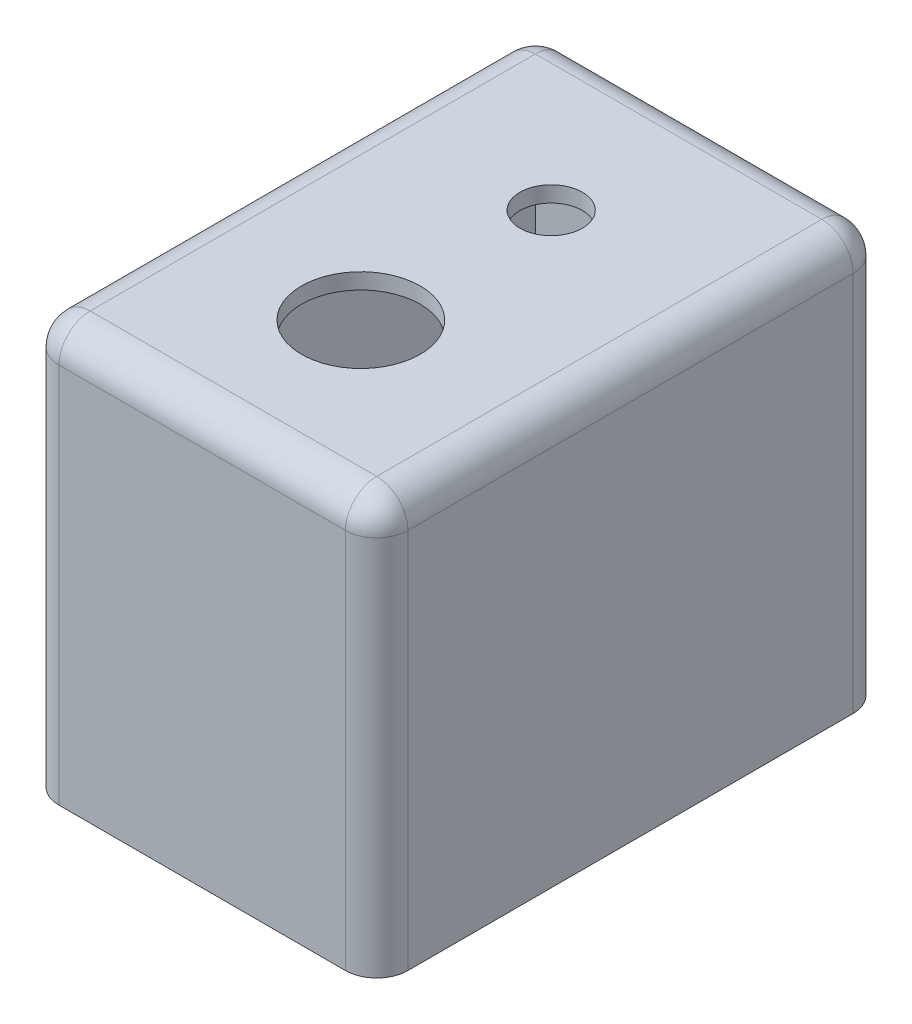
ISO-10303-21;
HEADER;
FILE_DESCRIPTION(('STEP AP214'),'2;1');
FILE_NAME('part.step','',(''),(''),'','','');
FILE_SCHEMA(('AUTOMOTIVE_DESIGN { 1 0 10303 214 1 1 1 1 }'));
ENDSEC;
DATA;
#1=APPLICATION_CONTEXT('core data for automotive mechanical design processes');
#2=APPLICATION_PROTOCOL_DEFINITION('international standard','automotive_design',2000,#1);
#3=PRODUCT_CONTEXT('',#1,'mechanical');
#4=PRODUCT('Part','Part','',(#3));
#5=PRODUCT_RELATED_PRODUCT_CATEGORY('part','',(#4));
#6=PRODUCT_DEFINITION_FORMATION('','',#4);
#7=PRODUCT_DEFINITION_CONTEXT('part definition',#1,'design');
#8=PRODUCT_DEFINITION('design','',#6,#7);
#9=PRODUCT_DEFINITION_SHAPE('','',#8);
#10=(LENGTH_UNIT() NAMED_UNIT(*) SI_UNIT(.MILLI.,.METRE.));
#11=(NAMED_UNIT(*) PLANE_ANGLE_UNIT() SI_UNIT($,.RADIAN.));
#12=(NAMED_UNIT(*) SI_UNIT($,.STERADIAN.) SOLID_ANGLE_UNIT());
#13=UNCERTAINTY_MEASURE_WITH_UNIT(LENGTH_MEASURE(1.E-05),#10,'distance_accuracy_value','');
#14=(GEOMETRIC_REPRESENTATION_CONTEXT(3) GLOBAL_UNCERTAINTY_ASSIGNED_CONTEXT((#13)) GLOBAL_UNIT_ASSIGNED_CONTEXT((#10,
#11,#12)) REPRESENTATION_CONTEXT('',''));
#15=CARTESIAN_POINT('',(0.,0.,0.));
#16=DIRECTION('',(0.,0.,1.));
#17=DIRECTION('',(1.,0.,0.));
#18=AXIS2_PLACEMENT_3D('',#15,#16,#17);
#19=CARTESIAN_POINT('',(0.,0.,0.));
#20=DIRECTION('',(0.,1.,0.));
#21=DIRECTION('',(0.,0.,1.));
#22=AXIS2_PLACEMENT_3D('',#19,#20,#21);
#23=PLANE('',#22);
#24=DIRECTION('',(-1.,0.,0.));
#25=VECTOR('',#24,1.);
#26=CARTESIAN_POINT('',(-25.4,0.,-38.1));
#27=LINE('',#26,#25);
#28=CARTESIAN_POINT('',(25.4,0.,-38.1));
#29=VERTEX_POINT('',#28);
#30=CARTESIAN_POINT('',(10.,0.,-38.1));
#31=VERTEX_POINT('',#30);
#32=EDGE_CURVE('E173',#29,#31,#27,.T.);
#33=ORIENTED_EDGE('',*,*,#32,.T.);
#34=DIRECTION('',(0.,0.,-1.));
#35=VECTOR('',#34,1.);
#36=CARTESIAN_POINT('',(10.,0.,40.641));
#37=LINE('',#36,#35);
#38=CARTESIAN_POINT('',(10.,0.,-40.64));
#39=VERTEX_POINT('',#38);
#40=EDGE_CURVE('E62',#39,#31,#37,.F.);
#41=ORIENTED_EDGE('',*,*,#40,.F.);
#42=DIRECTION('',(-1.,0.,0.));
#43=VECTOR('',#42,1.);
#44=CARTESIAN_POINT('',(-27.94,0.,-40.64));
#45=LINE('',#44,#43);
#46=CARTESIAN_POINT('',(22.94,0.,-40.64));
#47=VERTEX_POINT('',#46);
#48=EDGE_CURVE('E170',#47,#39,#45,.T.);
#49=ORIENTED_EDGE('',*,*,#48,.F.);
#50=CARTESIAN_POINT('',(22.94,0.,-35.64));
#51=DIRECTION('',(0.,1.,0.));
#52=DIRECTION('',(0.,0.,1.));
#53=AXIS2_PLACEMENT_3D('',#50,#51,#52);
#54=CIRCLE('',#53,5.);
#55=CARTESIAN_POINT('',(27.94,0.,-35.64));
#56=VERTEX_POINT('',#55);
#57=EDGE_CURVE('E235',#47,#56,#54,.F.);
#58=ORIENTED_EDGE('',*,*,#57,.T.);
#59=DIRECTION('',(0.,0.,-1.));
#60=VECTOR('',#59,1.);
#61=CARTESIAN_POINT('',(27.94,0.,-40.64));
#62=LINE('',#61,#60);
#63=CARTESIAN_POINT('',(27.94,0.,35.64));
#64=VERTEX_POINT('',#63);
#65=EDGE_CURVE('E184',#64,#56,#62,.T.);
#66=ORIENTED_EDGE('',*,*,#65,.F.);
#67=CARTESIAN_POINT('',(22.94,0.,35.64));
#68=DIRECTION('',(0.,1.,0.));
#69=DIRECTION('',(0.,0.,1.));
#70=AXIS2_PLACEMENT_3D('',#67,#68,#69);
#71=CIRCLE('',#70,5.);
#72=CARTESIAN_POINT('',(22.94,0.,40.64));
#73=VERTEX_POINT('',#72);
#74=EDGE_CURVE('E249',#64,#73,#71,.F.);
#75=ORIENTED_EDGE('',*,*,#74,.T.);
#76=DIRECTION('',(1.,0.,0.));
#77=VECTOR('',#76,1.);
#78=CARTESIAN_POINT('',(-27.94,0.,40.64));
#79=LINE('',#78,#77);
#80=CARTESIAN_POINT('',(-22.94,0.,40.64));
#81=VERTEX_POINT('',#80);
#82=EDGE_CURVE('E182',#81,#73,#79,.T.);
#83=ORIENTED_EDGE('',*,*,#82,.F.);
#84=CARTESIAN_POINT('',(-22.94,0.,35.64));
#85=DIRECTION('',(0.,1.,0.));
#86=DIRECTION('',(0.,0.,1.));
#87=AXIS2_PLACEMENT_3D('',#84,#85,#86);
#88=CIRCLE('',#87,5.);
#89=CARTESIAN_POINT('',(-27.94,0.,35.64));
#90=VERTEX_POINT('',#89);
#91=EDGE_CURVE('E55',#81,#90,#88,.F.);
#92=ORIENTED_EDGE('',*,*,#91,.T.);
#93=DIRECTION('',(0.,0.,1.));
#94=VECTOR('',#93,1.);
#95=CARTESIAN_POINT('',(-27.94,0.,-40.64));
#96=LINE('',#95,#94);
#97=CARTESIAN_POINT('',(-27.94,0.,-35.64));
#98=VERTEX_POINT('',#97);
#99=EDGE_CURVE('E179',#98,#90,#96,.T.);
#100=ORIENTED_EDGE('',*,*,#99,.F.);
#101=CARTESIAN_POINT('',(-22.94,0.,-35.64));
#102=DIRECTION('',(0.,1.,0.));
#103=DIRECTION('',(0.,0.,1.));
#104=AXIS2_PLACEMENT_3D('',#101,#102,#103);
#105=CIRCLE('',#104,5.);
#106=CARTESIAN_POINT('',(-22.94,0.,-40.64));
#107=VERTEX_POINT('',#106);
#108=EDGE_CURVE('E219',#98,#107,#105,.F.);
#109=ORIENTED_EDGE('',*,*,#108,.T.);
#110=CARTESIAN_POINT('',(-10.,0.,-40.64));
#111=VERTEX_POINT('',#110);
#112=EDGE_CURVE('E180',#111,#107,#45,.T.);
#113=ORIENTED_EDGE('',*,*,#112,.F.);
#114=DIRECTION('',(0.,0.,-1.));
#115=VECTOR('',#114,1.);
#116=CARTESIAN_POINT('',(-10.,0.,40.641));
#117=LINE('',#116,#115);
#118=CARTESIAN_POINT('',(-10.,0.,-38.1));
#119=VERTEX_POINT('',#118);
#120=EDGE_CURVE('E161',#119,#111,#117,.T.);
#121=ORIENTED_EDGE('',*,*,#120,.F.);
#122=CARTESIAN_POINT('',(-25.4,0.,-38.1));
#123=VERTEX_POINT('',#122);
#124=EDGE_CURVE('E328',#119,#123,#27,.T.);
#125=ORIENTED_EDGE('',*,*,#124,.T.);
#126=DIRECTION('',(0.,0.,1.));
#127=VECTOR('',#126,1.);
#128=CARTESIAN_POINT('',(-25.4,0.,-38.1));
#129=LINE('',#128,#127);
#130=CARTESIAN_POINT('',(-25.4,0.,38.1));
#131=VERTEX_POINT('',#130);
#132=EDGE_CURVE('E324',#123,#131,#129,.T.);
#133=ORIENTED_EDGE('',*,*,#132,.T.);
#134=DIRECTION('',(1.,0.,0.));
#135=VECTOR('',#134,1.);
#136=CARTESIAN_POINT('',(-25.4,0.,38.1));
#137=LINE('',#136,#135);
#138=CARTESIAN_POINT('',(25.4,0.,38.1));
#139=VERTEX_POINT('',#138);
#140=EDGE_CURVE('E320',#131,#139,#137,.T.);
#141=ORIENTED_EDGE('',*,*,#140,.T.);
#142=DIRECTION('',(0.,0.,-1.));
#143=VECTOR('',#142,1.);
#144=CARTESIAN_POINT('',(25.4,0.,-38.1));
#145=LINE('',#144,#143);
#146=EDGE_CURVE('E228',#139,#29,#145,.T.);
#147=ORIENTED_EDGE('',*,*,#146,.T.);
#148=EDGE_LOOP('',(#33,#41,#49,#58,#66,#75,#83,#92,#100,#109,#113,#121,#125,#133,#141,#147));
#149=FACE_BOUND('',#148,.T.);
#150=ADVANCED_FACE('F46',(#149),#23,.F.);
#151=CARTESIAN_POINT('',(27.94,63.5,-40.64));
#152=DIRECTION('',(-1.,0.,0.));
#153=DIRECTION('',(0.,0.,1.));
#154=AXIS2_PLACEMENT_3D('',#151,#152,#153);
#155=PLANE('',#154);
#156=DIRECTION('',(0.,0.,1.));
#157=VECTOR('',#156,1.);
#158=CARTESIAN_POINT('',(27.94,61.04,-40.64));
#159=LINE('',#158,#157);
#160=CARTESIAN_POINT('',(27.94,61.04,-35.64));
#161=VERTEX_POINT('',#160);
#162=CARTESIAN_POINT('',(27.94,61.04,35.64));
#163=VERTEX_POINT('',#162);
#164=EDGE_CURVE('E189',#161,#163,#159,.T.);
#165=ORIENTED_EDGE('',*,*,#164,.T.);
#166=DIRECTION('',(0.,-1.,0.));
#167=VECTOR('',#166,1.);
#168=CARTESIAN_POINT('',(27.94,63.5,35.64));
#169=LINE('',#168,#167);
#170=EDGE_CURVE('E247',#163,#64,#169,.T.);
#171=ORIENTED_EDGE('',*,*,#170,.T.);
#172=ORIENTED_EDGE('',*,*,#65,.T.);
#173=DIRECTION('',(0.,-1.,0.));
#174=VECTOR('',#173,1.);
#175=CARTESIAN_POINT('',(27.94,63.5,-35.64));
#176=LINE('',#175,#174);
#177=EDGE_CURVE('E237',#56,#161,#176,.F.);
#178=ORIENTED_EDGE('',*,*,#177,.T.);
#179=EDGE_LOOP('',(#165,#171,#172,#178));
#180=FACE_BOUND('',#179,.T.);
#181=ADVANCED_FACE('F303',(#180),#155,.F.);
#182=CARTESIAN_POINT('',(-27.94,63.5,-40.64));
#183=DIRECTION('',(0.,0.,1.));
#184=DIRECTION('',(1.,0.,0.));
#185=AXIS2_PLACEMENT_3D('',#182,#183,#184);
#186=PLANE('',#185);
#187=ORIENTED_EDGE('',*,*,#48,.T.);
#188=CARTESIAN_POINT('',(0.,0.,-40.64));
#189=DIRECTION('',(0.,0.,-1.));
#190=DIRECTION('',(-1.,0.,0.));
#191=AXIS2_PLACEMENT_3D('',#188,#189,#190);
#192=CIRCLE('',#191,10.);
#193=EDGE_CURVE('E158',#111,#39,#192,.T.);
#194=ORIENTED_EDGE('',*,*,#193,.F.);
#195=ORIENTED_EDGE('',*,*,#112,.T.);
#196=DIRECTION('',(0.,-1.,0.));
#197=VECTOR('',#196,1.);
#198=CARTESIAN_POINT('',(-22.94,63.5,-40.64));
#199=LINE('',#198,#197);
#200=CARTESIAN_POINT('',(-22.94,61.04,-40.64));
#201=VERTEX_POINT('',#200);
#202=EDGE_CURVE('E222',#107,#201,#199,.F.);
#203=ORIENTED_EDGE('',*,*,#202,.T.);
#204=DIRECTION('',(-1.,0.,0.));
#205=VECTOR('',#204,1.);
#206=CARTESIAN_POINT('',(-27.94,61.04,-40.64));
#207=LINE('',#206,#205);
#208=CARTESIAN_POINT('',(22.94,61.04,-40.64));
#209=VERTEX_POINT('',#208);
#210=EDGE_CURVE('E209',#201,#209,#207,.F.);
#211=ORIENTED_EDGE('',*,*,#210,.T.);
#212=DIRECTION('',(0.,-1.,0.));
#213=VECTOR('',#212,1.);
#214=CARTESIAN_POINT('',(22.94,63.5,-40.64));
#215=LINE('',#214,#213);
#216=EDGE_CURVE('E178',#209,#47,#215,.T.);
#217=ORIENTED_EDGE('',*,*,#216,.T.);
#218=EDGE_LOOP('',(#187,#194,#195,#203,#211,#217));
#219=FACE_BOUND('',#218,.T.);
#220=ADVANCED_FACE('F175',(#219),#186,.F.);
#221=CARTESIAN_POINT('',(-27.94,63.5,-40.64));
#222=DIRECTION('',(1.,0.,0.));
#223=DIRECTION('',(0.,0.,-1.));
#224=AXIS2_PLACEMENT_3D('',#221,#222,#223);
#225=PLANE('',#224);
#226=ORIENTED_EDGE('',*,*,#99,.T.);
#227=DIRECTION('',(0.,-1.,0.));
#228=VECTOR('',#227,1.);
#229=CARTESIAN_POINT('',(-27.94,63.5,35.64));
#230=LINE('',#229,#228);
#231=CARTESIAN_POINT('',(-27.94,61.04,35.64));
#232=VERTEX_POINT('',#231);
#233=EDGE_CURVE('E13',#90,#232,#230,.F.);
#234=ORIENTED_EDGE('',*,*,#233,.T.);
#235=DIRECTION('',(0.,0.,1.));
#236=VECTOR('',#235,1.);
#237=CARTESIAN_POINT('',(-27.94,61.04,-40.64));
#238=LINE('',#237,#236);
#239=CARTESIAN_POINT('',(-27.94,61.04,-35.64));
#240=VERTEX_POINT('',#239);
#241=EDGE_CURVE('E207',#232,#240,#238,.F.);
#242=ORIENTED_EDGE('',*,*,#241,.T.);
#243=DIRECTION('',(0.,-1.,0.));
#244=VECTOR('',#243,1.);
#245=CARTESIAN_POINT('',(-27.94,63.5,-35.64));
#246=LINE('',#245,#244);
#247=EDGE_CURVE('E217',#240,#98,#246,.T.);
#248=ORIENTED_EDGE('',*,*,#247,.T.);
#249=EDGE_LOOP('',(#226,#234,#242,#248));
#250=FACE_BOUND('',#249,.T.);
#251=ADVANCED_FACE('F274',(#250),#225,.F.);
#252=CARTESIAN_POINT('',(-27.94,63.5,40.64));
#253=DIRECTION('',(0.,0.,-1.));
#254=DIRECTION('',(-1.,0.,0.));
#255=AXIS2_PLACEMENT_3D('',#252,#253,#254);
#256=PLANE('',#255);
#257=DIRECTION('',(-1.,0.,0.));
#258=VECTOR('',#257,1.);
#259=CARTESIAN_POINT('',(-27.94,61.04,40.64));
#260=LINE('',#259,#258);
#261=CARTESIAN_POINT('',(22.94,61.04,40.64));
#262=VERTEX_POINT('',#261);
#263=CARTESIAN_POINT('',(-22.94,61.04,40.64));
#264=VERTEX_POINT('',#263);
#265=EDGE_CURVE('E204',#262,#264,#260,.T.);
#266=ORIENTED_EDGE('',*,*,#265,.T.);
#267=DIRECTION('',(0.,-1.,0.));
#268=VECTOR('',#267,1.);
#269=CARTESIAN_POINT('',(-22.94,63.5,40.64));
#270=LINE('',#269,#268);
#271=EDGE_CURVE('E260',#264,#81,#270,.T.);
#272=ORIENTED_EDGE('',*,*,#271,.T.);
#273=ORIENTED_EDGE('',*,*,#82,.T.);
#274=DIRECTION('',(0.,-1.,0.));
#275=VECTOR('',#274,1.);
#276=CARTESIAN_POINT('',(22.94,63.5,40.64));
#277=LINE('',#276,#275);
#278=EDGE_CURVE('E252',#73,#262,#277,.F.);
#279=ORIENTED_EDGE('',*,*,#278,.T.);
#280=EDGE_LOOP('',(#266,#272,#273,#279));
#281=FACE_BOUND('',#280,.T.);
#282=ADVANCED_FACE('F264',(#281),#256,.F.);
#283=CARTESIAN_POINT('',(25.4,63.5,-38.1));
#284=DIRECTION('',(-1.,0.,0.));
#285=DIRECTION('',(0.,0.,1.));
#286=AXIS2_PLACEMENT_3D('',#283,#284,#285);
#287=PLANE('',#286);
#288=ORIENTED_EDGE('',*,*,#146,.F.);
#289=DIRECTION('',(0.,-1.,0.));
#290=VECTOR('',#289,1.);
#291=CARTESIAN_POINT('',(25.4,63.5,38.1));
#292=LINE('',#291,#290);
#293=CARTESIAN_POINT('',(25.4,63.5,38.1));
#294=VERTEX_POINT('',#293);
#295=EDGE_CURVE('E316',#294,#139,#292,.T.);
#296=ORIENTED_EDGE('',*,*,#295,.F.);
#297=DIRECTION('',(0.,0.,-1.));
#298=VECTOR('',#297,1.);
#299=CARTESIAN_POINT('',(25.4,63.5,-38.1));
#300=LINE('',#299,#298);
#301=CARTESIAN_POINT('',(25.4,63.5,-38.1));
#302=VERTEX_POINT('',#301);
#303=EDGE_CURVE('E323',#294,#302,#300,.T.);
#304=ORIENTED_EDGE('',*,*,#303,.T.);
#305=DIRECTION('',(0.,-1.,0.));
#306=VECTOR('',#305,1.);
#307=CARTESIAN_POINT('',(25.4,63.5,-38.1));
#308=LINE('',#307,#306);
#309=EDGE_CURVE('E305',#302,#29,#308,.T.);
#310=ORIENTED_EDGE('',*,*,#309,.T.);
#311=EDGE_LOOP('',(#288,#296,#304,#310));
#312=FACE_BOUND('',#311,.T.);
#313=ADVANCED_FACE('F388',(#312),#287,.T.);
#314=CARTESIAN_POINT('',(-25.4,63.5,-38.1));
#315=DIRECTION('',(0.,0.,1.));
#316=DIRECTION('',(1.,0.,0.));
#317=AXIS2_PLACEMENT_3D('',#314,#315,#316);
#318=PLANE('',#317);
#319=CARTESIAN_POINT('',(0.,0.,-38.1));
#320=DIRECTION('',(0.,0.,1.));
#321=DIRECTION('',(1.,0.,0.));
#322=AXIS2_PLACEMENT_3D('',#319,#320,#321);
#323=CIRCLE('',#322,10.);
#324=EDGE_CURVE('E165',#119,#31,#323,.F.);
#325=ORIENTED_EDGE('',*,*,#324,.T.);
#326=ORIENTED_EDGE('',*,*,#32,.F.);
#327=ORIENTED_EDGE('',*,*,#309,.F.);
#328=DIRECTION('',(-1.,0.,0.));
#329=VECTOR('',#328,1.);
#330=CARTESIAN_POINT('',(-25.4,63.5,-38.1));
#331=LINE('',#330,#329);
#332=CARTESIAN_POINT('',(-25.4,63.5,-38.1));
#333=VERTEX_POINT('',#332);
#334=EDGE_CURVE('E335',#302,#333,#331,.T.);
#335=ORIENTED_EDGE('',*,*,#334,.T.);
#336=DIRECTION('',(0.,-1.,0.));
#337=VECTOR('',#336,1.);
#338=CARTESIAN_POINT('',(-25.4,63.5,-38.1));
#339=LINE('',#338,#337);
#340=EDGE_CURVE('E307',#333,#123,#339,.T.);
#341=ORIENTED_EDGE('',*,*,#340,.T.);
#342=ORIENTED_EDGE('',*,*,#124,.F.);
#343=EDGE_LOOP('',(#325,#326,#327,#335,#341,#342));
#344=FACE_BOUND('',#343,.T.);
#345=ADVANCED_FACE('F354',(#344),#318,.T.);
#346=CARTESIAN_POINT('',(-25.4,63.5,-38.1));
#347=DIRECTION('',(1.,0.,0.));
#348=DIRECTION('',(0.,0.,-1.));
#349=AXIS2_PLACEMENT_3D('',#346,#347,#348);
#350=PLANE('',#349);
#351=ORIENTED_EDGE('',*,*,#132,.F.);
#352=ORIENTED_EDGE('',*,*,#340,.F.);
#353=DIRECTION('',(0.,0.,1.));
#354=VECTOR('',#353,1.);
#355=CARTESIAN_POINT('',(-25.4,63.5,-38.1));
#356=LINE('',#355,#354);
#357=CARTESIAN_POINT('',(-25.4,63.5,38.1));
#358=VERTEX_POINT('',#357);
#359=EDGE_CURVE('E332',#333,#358,#356,.T.);
#360=ORIENTED_EDGE('',*,*,#359,.T.);
#361=DIRECTION('',(0.,-1.,0.));
#362=VECTOR('',#361,1.);
#363=CARTESIAN_POINT('',(-25.4,63.5,38.1));
#364=LINE('',#363,#362);
#365=EDGE_CURVE('E312',#358,#131,#364,.T.);
#366=ORIENTED_EDGE('',*,*,#365,.T.);
#367=EDGE_LOOP('',(#351,#352,#360,#366));
#368=FACE_BOUND('',#367,.T.);
#369=ADVANCED_FACE('F420',(#368),#350,.T.);
#370=CARTESIAN_POINT('',(-25.4,63.5,38.1));
#371=DIRECTION('',(0.,0.,-1.));
#372=DIRECTION('',(-1.,0.,0.));
#373=AXIS2_PLACEMENT_3D('',#370,#371,#372);
#374=PLANE('',#373);
#375=ORIENTED_EDGE('',*,*,#140,.F.);
#376=ORIENTED_EDGE('',*,*,#365,.F.);
#377=DIRECTION('',(1.,0.,0.));
#378=VECTOR('',#377,1.);
#379=CARTESIAN_POINT('',(-25.4,63.5,38.1));
#380=LINE('',#379,#378);
#381=EDGE_CURVE('E319',#358,#294,#380,.T.);
#382=ORIENTED_EDGE('',*,*,#381,.T.);
#383=ORIENTED_EDGE('',*,*,#295,.T.);
#384=EDGE_LOOP('',(#375,#376,#382,#383));
#385=FACE_BOUND('',#384,.T.);
#386=ADVANCED_FACE('F410',(#385),#374,.T.);
#387=CARTESIAN_POINT('',(27.94,63.5,40.64));
#388=DIRECTION('',(0.,1.,0.));
#389=DIRECTION('',(0.,0.,1.));
#390=AXIS2_PLACEMENT_3D('',#387,#388,#389);
#391=PLANE('',#390);
#392=CARTESIAN_POINT('',(0.,63.5,-15.24));
#393=DIRECTION('',(0.,1.,0.));
#394=DIRECTION('',(0.,0.,1.));
#395=AXIS2_PLACEMENT_3D('',#392,#393,#394);
#396=CIRCLE('',#395,5.);
#397=CARTESIAN_POINT('',(0.,63.5,-10.24));
#398=VERTEX_POINT('',#397);
#399=EDGE_CURVE('E346',#398,#398,#396,.T.);
#400=ORIENTED_EDGE('',*,*,#399,.T.);
#401=EDGE_LOOP('',(#400));
#402=FACE_BOUND('',#401,.T.);
#403=CARTESIAN_POINT('',(0.,63.5,15.24));
#404=DIRECTION('',(0.,1.,0.));
#405=DIRECTION('',(0.,0.,1.));
#406=AXIS2_PLACEMENT_3D('',#403,#404,#405);
#407=CIRCLE('',#406,9.5);
#408=CARTESIAN_POINT('',(0.,63.5,24.74));
#409=VERTEX_POINT('',#408);
#410=EDGE_CURVE('E339',#409,#409,#407,.T.);
#411=ORIENTED_EDGE('',*,*,#410,.T.);
#412=EDGE_LOOP('',(#411));
#413=FACE_BOUND('',#412,.T.);
#414=ORIENTED_EDGE('',*,*,#334,.F.);
#415=ORIENTED_EDGE('',*,*,#303,.F.);
#416=ORIENTED_EDGE('',*,*,#381,.F.);
#417=ORIENTED_EDGE('',*,*,#359,.F.);
#418=EDGE_LOOP('',(#414,#415,#416,#417));
#419=FACE_BOUND('',#418,.T.);
#420=ADVANCED_FACE('F404',(#402,#413,#419),#391,.F.);
#421=CARTESIAN_POINT('',(27.94,66.04,40.64));
#422=DIRECTION('',(0.,-1.,0.));
#423=DIRECTION('',(0.,0.,-1.));
#424=AXIS2_PLACEMENT_3D('',#421,#422,#423);
#425=PLANE('',#424);
#426=CARTESIAN_POINT('',(0.,66.04,-15.24));
#427=DIRECTION('',(0.,-1.,0.));
#428=DIRECTION('',(0.,0.,-1.));
#429=AXIS2_PLACEMENT_3D('',#426,#427,#428);
#430=CIRCLE('',#429,5.);
#431=CARTESIAN_POINT('',(0.,66.04,-20.24));
#432=VERTEX_POINT('',#431);
#433=EDGE_CURVE('E342',#432,#432,#430,.T.);
#434=ORIENTED_EDGE('',*,*,#433,.T.);
#435=EDGE_LOOP('',(#434));
#436=FACE_BOUND('',#435,.T.);
#437=CARTESIAN_POINT('',(0.,66.04,15.24));
#438=DIRECTION('',(0.,-1.,0.));
#439=DIRECTION('',(0.,0.,-1.));
#440=AXIS2_PLACEMENT_3D('',#437,#438,#439);
#441=CIRCLE('',#440,9.5);
#442=CARTESIAN_POINT('',(0.,66.04,5.74));
#443=VERTEX_POINT('',#442);
#444=EDGE_CURVE('E343',#443,#443,#441,.T.);
#445=ORIENTED_EDGE('',*,*,#444,.T.);
#446=EDGE_LOOP('',(#445));
#447=FACE_BOUND('',#446,.T.);
#448=DIRECTION('',(-1.,0.,0.));
#449=VECTOR('',#448,1.);
#450=CARTESIAN_POINT('',(27.94,66.04,35.64));
#451=LINE('',#450,#449);
#452=CARTESIAN_POINT('',(-22.94,66.04,35.64));
#453=VERTEX_POINT('',#452);
#454=CARTESIAN_POINT('',(22.94,66.04,35.64));
#455=VERTEX_POINT('',#454);
#456=EDGE_CURVE('E198',#453,#455,#451,.F.);
#457=ORIENTED_EDGE('',*,*,#456,.T.);
#458=DIRECTION('',(0.,0.,1.));
#459=VECTOR('',#458,1.);
#460=CARTESIAN_POINT('',(22.94,66.04,40.64));
#461=LINE('',#460,#459);
#462=CARTESIAN_POINT('',(22.94,66.04,-35.64));
#463=VERTEX_POINT('',#462);
#464=EDGE_CURVE('E201',#455,#463,#461,.F.);
#465=ORIENTED_EDGE('',*,*,#464,.T.);
#466=DIRECTION('',(-1.,0.,0.));
#467=VECTOR('',#466,1.);
#468=CARTESIAN_POINT('',(27.94,66.04,-35.64));
#469=LINE('',#468,#467);
#470=CARTESIAN_POINT('',(-22.94,66.04,-35.64));
#471=VERTEX_POINT('',#470);
#472=EDGE_CURVE('E192',#463,#471,#469,.T.);
#473=ORIENTED_EDGE('',*,*,#472,.T.);
#474=DIRECTION('',(0.,0.,1.));
#475=VECTOR('',#474,1.);
#476=CARTESIAN_POINT('',(-22.94,66.04,40.64));
#477=LINE('',#476,#475);
#478=EDGE_CURVE('E195',#471,#453,#477,.T.);
#479=ORIENTED_EDGE('',*,*,#478,.T.);
#480=EDGE_LOOP('',(#457,#465,#473,#479));
#481=FACE_BOUND('',#480,.T.);
#482=ADVANCED_FACE('F289',(#436,#447,#481),#425,.F.);
#483=CARTESIAN_POINT('',(-22.94,61.04,40.64));
#484=DIRECTION('',(0.,0.,1.));
#485=DIRECTION('',(1.,0.,0.));
#486=AXIS2_PLACEMENT_3D('',#483,#484,#485);
#487=CYLINDRICAL_SURFACE('',#486,5.);
#488=ORIENTED_EDGE('',*,*,#241,.F.);
#489=CARTESIAN_POINT('',(-22.94,61.04,35.64));
#490=DIRECTION('',(0.,0.,1.));
#491=DIRECTION('',(1.,0.,0.));
#492=AXIS2_PLACEMENT_3D('',#489,#490,#491);
#493=CIRCLE('',#492,5.);
#494=EDGE_CURVE('E258',#232,#453,#493,.F.);
#495=ORIENTED_EDGE('',*,*,#494,.T.);
#496=ORIENTED_EDGE('',*,*,#478,.F.);
#497=CARTESIAN_POINT('',(-22.94,61.04,-35.64));
#498=DIRECTION('',(0.,0.,1.));
#499=DIRECTION('',(1.,0.,0.));
#500=AXIS2_PLACEMENT_3D('',#497,#498,#499);
#501=CIRCLE('',#500,5.);
#502=EDGE_CURVE('E214',#471,#240,#501,.T.);
#503=ORIENTED_EDGE('',*,*,#502,.T.);
#504=EDGE_LOOP('',(#488,#495,#496,#503));
#505=FACE_BOUND('',#504,.T.);
#506=ADVANCED_FACE('F277',(#505),#487,.T.);
#507=CARTESIAN_POINT('',(27.94,61.04,-35.64));
#508=DIRECTION('',(-1.,0.,0.));
#509=DIRECTION('',(0.,0.,1.));
#510=AXIS2_PLACEMENT_3D('',#507,#508,#509);
#511=CYLINDRICAL_SURFACE('',#510,5.);
#512=ORIENTED_EDGE('',*,*,#472,.F.);
#513=CARTESIAN_POINT('',(22.94,61.04,-35.64));
#514=DIRECTION('',(-1.,0.,0.));
#515=DIRECTION('',(0.,0.,1.));
#516=AXIS2_PLACEMENT_3D('',#513,#514,#515);
#517=CIRCLE('',#516,5.);
#518=EDGE_CURVE('E232',#463,#209,#517,.T.);
#519=ORIENTED_EDGE('',*,*,#518,.T.);
#520=ORIENTED_EDGE('',*,*,#210,.F.);
#521=CARTESIAN_POINT('',(-22.94,61.04,-35.64));
#522=DIRECTION('',(-1.,0.,0.));
#523=DIRECTION('',(0.,0.,1.));
#524=AXIS2_PLACEMENT_3D('',#521,#522,#523);
#525=CIRCLE('',#524,5.);
#526=EDGE_CURVE('E211',#201,#471,#525,.F.);
#527=ORIENTED_EDGE('',*,*,#526,.T.);
#528=EDGE_LOOP('',(#512,#519,#520,#527));
#529=FACE_BOUND('',#528,.T.);
#530=ADVANCED_FACE('F361',(#529),#511,.T.);
#531=CARTESIAN_POINT('',(-27.94,61.04,35.64));
#532=DIRECTION('',(-1.,0.,0.));
#533=DIRECTION('',(0.,0.,1.));
#534=AXIS2_PLACEMENT_3D('',#531,#532,#533);
#535=CYLINDRICAL_SURFACE('',#534,5.);
#536=ORIENTED_EDGE('',*,*,#456,.F.);
#537=CARTESIAN_POINT('',(-22.94,61.04,35.64));
#538=DIRECTION('',(-1.,0.,0.));
#539=DIRECTION('',(0.,0.,1.));
#540=AXIS2_PLACEMENT_3D('',#537,#538,#539);
#541=CIRCLE('',#540,5.);
#542=EDGE_CURVE('E254',#453,#264,#541,.F.);
#543=ORIENTED_EDGE('',*,*,#542,.T.);
#544=ORIENTED_EDGE('',*,*,#265,.F.);
#545=CARTESIAN_POINT('',(22.94,61.04,35.64));
#546=DIRECTION('',(-1.,0.,0.));
#547=DIRECTION('',(0.,0.,1.));
#548=AXIS2_PLACEMENT_3D('',#545,#546,#547);
#549=CIRCLE('',#548,5.);
#550=EDGE_CURVE('E245',#262,#455,#549,.T.);
#551=ORIENTED_EDGE('',*,*,#550,.T.);
#552=EDGE_LOOP('',(#536,#543,#544,#551));
#553=FACE_BOUND('',#552,.T.);
#554=ADVANCED_FACE('F285',(#553),#535,.T.);
#555=CARTESIAN_POINT('',(22.94,61.04,-40.64));
#556=DIRECTION('',(0.,0.,1.));
#557=DIRECTION('',(1.,0.,0.));
#558=AXIS2_PLACEMENT_3D('',#555,#556,#557);
#559=CYLINDRICAL_SURFACE('',#558,5.);
#560=ORIENTED_EDGE('',*,*,#464,.F.);
#561=CARTESIAN_POINT('',(22.94,61.04,35.64));
#562=DIRECTION('',(0.,0.,1.));
#563=DIRECTION('',(1.,0.,0.));
#564=AXIS2_PLACEMENT_3D('',#561,#562,#563);
#565=CIRCLE('',#564,5.);
#566=EDGE_CURVE('E239',#455,#163,#565,.F.);
#567=ORIENTED_EDGE('',*,*,#566,.T.);
#568=ORIENTED_EDGE('',*,*,#164,.F.);
#569=CARTESIAN_POINT('',(22.94,61.04,-35.64));
#570=DIRECTION('',(0.,0.,1.));
#571=DIRECTION('',(1.,0.,0.));
#572=AXIS2_PLACEMENT_3D('',#569,#570,#571);
#573=CIRCLE('',#572,5.);
#574=EDGE_CURVE('E224',#161,#463,#573,.T.);
#575=ORIENTED_EDGE('',*,*,#574,.T.);
#576=EDGE_LOOP('',(#560,#567,#568,#575));
#577=FACE_BOUND('',#576,.T.);
#578=ADVANCED_FACE('F292',(#577),#559,.T.);
#579=CARTESIAN_POINT('',(-22.94,63.5,-35.64));
#580=DIRECTION('',(0.,-1.,0.));
#581=DIRECTION('',(0.,0.,-1.));
#582=AXIS2_PLACEMENT_3D('',#579,#580,#581);
#583=CYLINDRICAL_SURFACE('',#582,5.);
#584=ORIENTED_EDGE('',*,*,#108,.F.);
#585=ORIENTED_EDGE('',*,*,#247,.F.);
#586=CARTESIAN_POINT('',(-22.94,61.04,-35.64));
#587=DIRECTION('',(0.,1.,0.));
#588=DIRECTION('',(0.,0.,1.));
#589=AXIS2_PLACEMENT_3D('',#586,#587,#588);
#590=CIRCLE('',#589,5.);
#591=EDGE_CURVE('E225',#201,#240,#590,.T.);
#592=ORIENTED_EDGE('',*,*,#591,.F.);
#593=ORIENTED_EDGE('',*,*,#202,.F.);
#594=EDGE_LOOP('',(#584,#585,#592,#593));
#595=FACE_BOUND('',#594,.T.);
#596=ADVANCED_FACE('F363',(#595),#583,.T.);
#597=CARTESIAN_POINT('',(-22.94,61.04,-35.64));
#598=DIRECTION('',(0.,0.,1.));
#599=DIRECTION('',(1.,0.,0.));
#600=AXIS2_PLACEMENT_3D('',#597,#598,#599);
#601=SPHERICAL_SURFACE('',#600,5.);
#602=ORIENTED_EDGE('',*,*,#591,.T.);
#603=ORIENTED_EDGE('',*,*,#502,.F.);
#604=ORIENTED_EDGE('',*,*,#526,.F.);
#605=EDGE_LOOP('',(#602,#603,#604));
#606=FACE_BOUND('',#605,.T.);
#607=ADVANCED_FACE('F365',(#606),#601,.T.);
#608=CARTESIAN_POINT('',(22.94,63.5,-35.64));
#609=DIRECTION('',(0.,-1.,0.));
#610=DIRECTION('',(0.,0.,-1.));
#611=AXIS2_PLACEMENT_3D('',#608,#609,#610);
#612=CYLINDRICAL_SURFACE('',#611,5.);
#613=ORIENTED_EDGE('',*,*,#57,.F.);
#614=ORIENTED_EDGE('',*,*,#216,.F.);
#615=CARTESIAN_POINT('',(22.94,61.04,-35.64));
#616=DIRECTION('',(0.,1.,0.));
#617=DIRECTION('',(0.,0.,1.));
#618=AXIS2_PLACEMENT_3D('',#615,#616,#617);
#619=CIRCLE('',#618,5.);
#620=EDGE_CURVE('E229',#161,#209,#619,.T.);
#621=ORIENTED_EDGE('',*,*,#620,.F.);
#622=ORIENTED_EDGE('',*,*,#177,.F.);
#623=EDGE_LOOP('',(#613,#614,#621,#622));
#624=FACE_BOUND('',#623,.T.);
#625=ADVANCED_FACE('F367',(#624),#612,.T.);
#626=CARTESIAN_POINT('',(22.94,61.04,-35.64));
#627=DIRECTION('',(0.,0.,1.));
#628=DIRECTION('',(1.,0.,0.));
#629=AXIS2_PLACEMENT_3D('',#626,#627,#628);
#630=SPHERICAL_SURFACE('',#629,5.);
#631=ORIENTED_EDGE('',*,*,#620,.T.);
#632=ORIENTED_EDGE('',*,*,#518,.F.);
#633=ORIENTED_EDGE('',*,*,#574,.F.);
#634=EDGE_LOOP('',(#631,#632,#633));
#635=FACE_BOUND('',#634,.T.);
#636=ADVANCED_FACE('F373',(#635),#630,.T.);
#637=CARTESIAN_POINT('',(22.94,63.5,35.64));
#638=DIRECTION('',(0.,-1.,0.));
#639=DIRECTION('',(0.,0.,-1.));
#640=AXIS2_PLACEMENT_3D('',#637,#638,#639);
#641=CYLINDRICAL_SURFACE('',#640,5.);
#642=ORIENTED_EDGE('',*,*,#74,.F.);
#643=ORIENTED_EDGE('',*,*,#170,.F.);
#644=CARTESIAN_POINT('',(22.94,61.04,35.64));
#645=DIRECTION('',(0.,1.,0.));
#646=DIRECTION('',(0.,0.,1.));
#647=AXIS2_PLACEMENT_3D('',#644,#645,#646);
#648=CIRCLE('',#647,5.);
#649=EDGE_CURVE('E242',#262,#163,#648,.T.);
#650=ORIENTED_EDGE('',*,*,#649,.F.);
#651=ORIENTED_EDGE('',*,*,#278,.F.);
#652=EDGE_LOOP('',(#642,#643,#650,#651));
#653=FACE_BOUND('',#652,.T.);
#654=ADVANCED_FACE('F301',(#653),#641,.T.);
#655=CARTESIAN_POINT('',(22.94,61.04,35.64));
#656=DIRECTION('',(0.,0.,1.));
#657=DIRECTION('',(1.,0.,0.));
#658=AXIS2_PLACEMENT_3D('',#655,#656,#657);
#659=SPHERICAL_SURFACE('',#658,5.);
#660=ORIENTED_EDGE('',*,*,#566,.F.);
#661=ORIENTED_EDGE('',*,*,#550,.F.);
#662=ORIENTED_EDGE('',*,*,#649,.T.);
#663=EDGE_LOOP('',(#660,#661,#662));
#664=FACE_BOUND('',#663,.T.);
#665=ADVANCED_FACE('F297',(#664),#659,.T.);
#666=CARTESIAN_POINT('',(-22.94,63.5,35.64));
#667=DIRECTION('',(0.,-1.,0.));
#668=DIRECTION('',(0.,0.,-1.));
#669=AXIS2_PLACEMENT_3D('',#666,#667,#668);
#670=CYLINDRICAL_SURFACE('',#669,5.);
#671=ORIENTED_EDGE('',*,*,#91,.F.);
#672=ORIENTED_EDGE('',*,*,#271,.F.);
#673=CARTESIAN_POINT('',(-22.94,61.04,35.64));
#674=DIRECTION('',(0.,1.,0.));
#675=DIRECTION('',(0.,0.,1.));
#676=AXIS2_PLACEMENT_3D('',#673,#674,#675);
#677=CIRCLE('',#676,5.);
#678=EDGE_CURVE('E50',#232,#264,#677,.T.);
#679=ORIENTED_EDGE('',*,*,#678,.F.);
#680=ORIENTED_EDGE('',*,*,#233,.F.);
#681=EDGE_LOOP('',(#671,#672,#679,#680));
#682=FACE_BOUND('',#681,.T.);
#683=ADVANCED_FACE('F48',(#682),#670,.T.);
#684=CARTESIAN_POINT('',(-22.94,61.04,35.64));
#685=DIRECTION('',(0.,0.,1.));
#686=DIRECTION('',(1.,0.,0.));
#687=AXIS2_PLACEMENT_3D('',#684,#685,#686);
#688=SPHERICAL_SURFACE('',#687,5.);
#689=ORIENTED_EDGE('',*,*,#542,.F.);
#690=ORIENTED_EDGE('',*,*,#494,.F.);
#691=ORIENTED_EDGE('',*,*,#678,.T.);
#692=EDGE_LOOP('',(#689,#690,#691));
#693=FACE_BOUND('',#692,.T.);
#694=ADVANCED_FACE('F282',(#693),#688,.T.);
#695=CARTESIAN_POINT('',(0.,66.041,15.24));
#696=DIRECTION('',(0.,-1.,0.));
#697=DIRECTION('',(0.,0.,-1.));
#698=AXIS2_PLACEMENT_3D('',#695,#696,#697);
#699=CYLINDRICAL_SURFACE('',#698,9.5);
#700=ORIENTED_EDGE('',*,*,#444,.F.);
#701=EDGE_LOOP('',(#700));
#702=FACE_BOUND('',#701,.T.);
#703=ORIENTED_EDGE('',*,*,#410,.F.);
#704=EDGE_LOOP('',(#703));
#705=FACE_BOUND('',#704,.T.);
#706=ADVANCED_FACE('F415',(#702,#705),#699,.F.);
#707=CARTESIAN_POINT('',(0.,66.041,-15.24));
#708=DIRECTION('',(0.,-1.,0.));
#709=DIRECTION('',(0.,0.,-1.));
#710=AXIS2_PLACEMENT_3D('',#707,#708,#709);
#711=CYLINDRICAL_SURFACE('',#710,5.);
#712=ORIENTED_EDGE('',*,*,#433,.F.);
#713=EDGE_LOOP('',(#712));
#714=FACE_BOUND('',#713,.T.);
#715=ORIENTED_EDGE('',*,*,#399,.F.);
#716=EDGE_LOOP('',(#715));
#717=FACE_BOUND('',#716,.T.);
#718=ADVANCED_FACE('F475',(#714,#717),#711,.F.);
#719=CARTESIAN_POINT('',(0.,0.,40.641));
#720=DIRECTION('',(0.,0.,-1.));
#721=DIRECTION('',(-1.,0.,0.));
#722=AXIS2_PLACEMENT_3D('',#719,#720,#721);
#723=CYLINDRICAL_SURFACE('',#722,10.);
#724=ORIENTED_EDGE('',*,*,#40,.T.);
#725=ORIENTED_EDGE('',*,*,#324,.F.);
#726=ORIENTED_EDGE('',*,*,#120,.T.);
#727=ORIENTED_EDGE('',*,*,#193,.T.);
#728=EDGE_LOOP('',(#724,#725,#726,#727));
#729=FACE_BOUND('',#728,.T.);
#730=ADVANCED_FACE('F159',(#729),#723,.F.);
#731=CLOSED_SHELL('',(#150,#181,#220,#251,#282,#313,#345,#369,#386,#420,#482,#506,#530,#554,
#578,#596,#607,#625,#636,#654,#665,#683,#694,#706,#718,#730));
#732=MANIFOLD_SOLID_BREP('B2',#731);
#733=ADVANCED_BREP_SHAPE_REPRESENTATION('',(#18,#732),#14);
#734=SHAPE_DEFINITION_REPRESENTATION(#9,#733);
ENDSEC;
END-ISO-10303-21;
